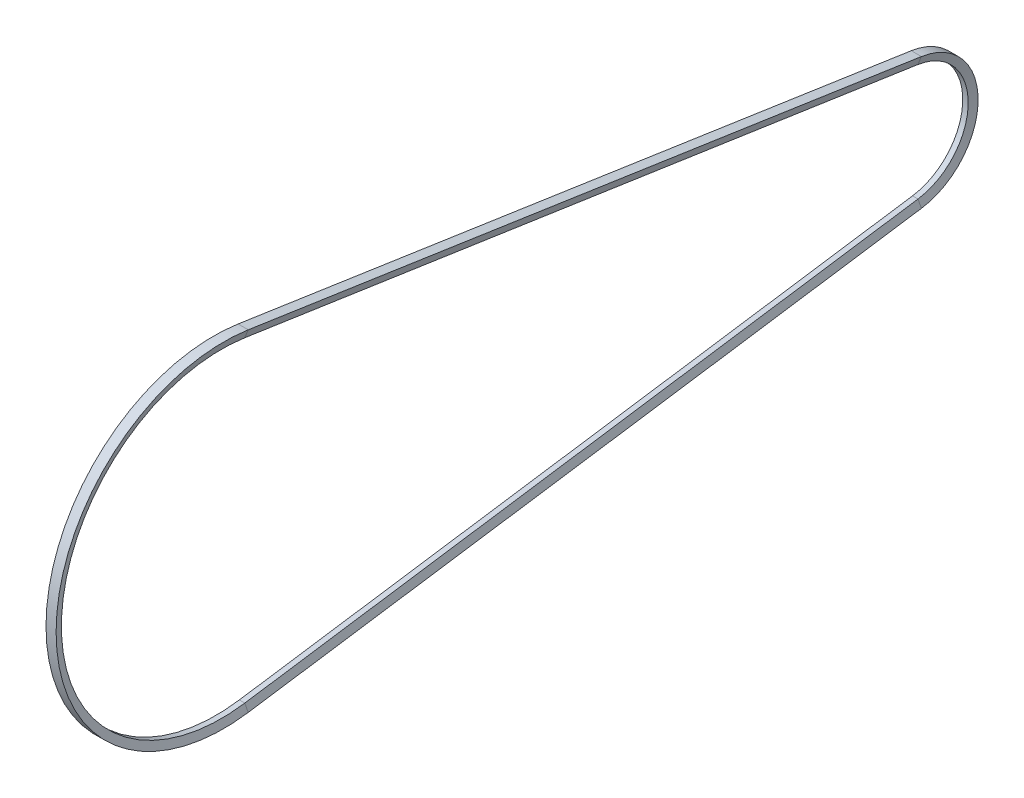
ISO-10303-21;
HEADER;
FILE_DESCRIPTION(('STEP AP214'),'2;1');
FILE_NAME('part.step','',(''),(''),'','','');
FILE_SCHEMA(('AUTOMOTIVE_DESIGN { 1 0 10303 214 1 1 1 1 }'));
ENDSEC;
DATA;
#1=APPLICATION_CONTEXT('core data for automotive mechanical design processes');
#2=APPLICATION_PROTOCOL_DEFINITION('international standard','automotive_design',2000,#1);
#3=PRODUCT_CONTEXT('',#1,'mechanical');
#4=PRODUCT('Part','Part','',(#3));
#5=PRODUCT_RELATED_PRODUCT_CATEGORY('part','',(#4));
#6=PRODUCT_DEFINITION_FORMATION('','',#4);
#7=PRODUCT_DEFINITION_CONTEXT('part definition',#1,'design');
#8=PRODUCT_DEFINITION('design','',#6,#7);
#9=PRODUCT_DEFINITION_SHAPE('','',#8);
#10=(LENGTH_UNIT() NAMED_UNIT(*) SI_UNIT(.MILLI.,.METRE.));
#11=(NAMED_UNIT(*) PLANE_ANGLE_UNIT() SI_UNIT($,.RADIAN.));
#12=(NAMED_UNIT(*) SI_UNIT($,.STERADIAN.) SOLID_ANGLE_UNIT());
#13=UNCERTAINTY_MEASURE_WITH_UNIT(LENGTH_MEASURE(1.E-05),#10,'distance_accuracy_value','');
#14=(GEOMETRIC_REPRESENTATION_CONTEXT(3) GLOBAL_UNCERTAINTY_ASSIGNED_CONTEXT((#13)) GLOBAL_UNIT_ASSIGNED_CONTEXT((#10,
#11,#12)) REPRESENTATION_CONTEXT('',''));
#15=CARTESIAN_POINT('',(0.,0.,0.));
#16=DIRECTION('',(0.,0.,1.));
#17=DIRECTION('',(1.,0.,0.));
#18=AXIS2_PLACEMENT_3D('',#15,#16,#17);
#19=CARTESIAN_POINT('',(5.12805125514121,109.499825302655,-1310.06663737334));
#20=DIRECTION('',(0.,-0.989158313483776,0.146853092803426));
#21=DIRECTION('',(0.,-0.146853092803426,-0.989158313483776));
#22=AXIS2_PLACEMENT_3D('',#19,#20,#21);
#23=PLANE('',#22);
#24=DIRECTION('',(1.,0.,0.));
#25=VECTOR('',#24,1.);
#26=CARTESIAN_POINT('',(5.12805125514121,109.499825302655,-1310.06663737334));
#27=LINE('',#26,#25);
#28=CARTESIAN_POINT('',(-5.12805125514121,109.499825302655,-1310.06663737334));
#29=VERTEX_POINT('',#28);
#30=CARTESIAN_POINT('',(5.12805125514121,109.499825302655,-1310.06663737334));
#31=VERTEX_POINT('',#30);
#32=EDGE_CURVE('E165',#29,#31,#27,.T.);
#33=ORIENTED_EDGE('',*,*,#32,.T.);
#34=DIRECTION('',(0.,0.146853092803426,0.989158313483776));
#35=VECTOR('',#34,1.);
#36=CARTESIAN_POINT('',(5.12805125514121,109.499825302655,-1310.06663737334));
#37=LINE('',#36,#35);
#38=CARTESIAN_POINT('',(5.12805125514121,297.439904864572,-44.1587250059865));
#39=VERTEX_POINT('',#38);
#40=EDGE_CURVE('E46',#31,#39,#37,.T.);
#41=ORIENTED_EDGE('',*,*,#40,.T.);
#42=DIRECTION('',(1.,0.,0.));
#43=VECTOR('',#42,1.);
#44=CARTESIAN_POINT('',(5.12805125514121,297.439904864572,-44.1587250059865));
#45=LINE('',#44,#43);
#46=CARTESIAN_POINT('',(-5.12805125514121,297.439904864572,-44.1587250059865));
#47=VERTEX_POINT('',#46);
#48=EDGE_CURVE('E186',#47,#39,#45,.T.);
#49=ORIENTED_EDGE('',*,*,#48,.F.);
#50=DIRECTION('',(0.,0.146853092803426,0.989158313483776));
#51=VECTOR('',#50,1.);
#52=CARTESIAN_POINT('',(-5.12805125514121,109.499825302655,-1310.06663737334));
#53=LINE('',#52,#51);
#54=EDGE_CURVE('E11',#29,#47,#53,.T.);
#55=ORIENTED_EDGE('',*,*,#54,.F.);
#56=EDGE_LOOP('',(#33,#41,#49,#55));
#57=FACE_BOUND('',#56,.T.);
#58=ADVANCED_FACE('F38',(#57),#23,.T.);
#59=CARTESIAN_POINT('',(9.5,123.644789185473,-1312.16663660042));
#60=DIRECTION('',(0.956304755963036,-0.289201902353916,0.0429356890867433));
#61=DIRECTION('',(0.289468839486019,0.957187437739661,0.));
#62=AXIS2_PLACEMENT_3D('',#59,#60,#61);
#63=PLANE('',#62);
#64=DIRECTION('',(0.292371704722734,0.945936799584913,-0.140436311075785));
#65=VECTOR('',#64,1.);
#66=CARTESIAN_POINT('',(9.5,123.644789185473,-1312.16663660042));
#67=LINE('',#66,#65);
#68=CARTESIAN_POINT('',(9.5,123.644789185473,-1312.16663660042));
#69=VERTEX_POINT('',#68);
#70=EDGE_CURVE('E162',#31,#69,#67,.T.);
#71=ORIENTED_EDGE('',*,*,#70,.T.);
#72=DIRECTION('',(0.,0.146853092803426,0.989158313483776));
#73=VECTOR('',#72,1.);
#74=CARTESIAN_POINT('',(9.5,123.644789185473,-1312.16663660042));
#75=LINE('',#74,#73);
#76=CARTESIAN_POINT('',(9.5,311.58486874739,-46.2587242330752));
#77=VERTEX_POINT('',#76);
#78=EDGE_CURVE('E191',#69,#77,#75,.T.);
#79=ORIENTED_EDGE('',*,*,#78,.T.);
#80=DIRECTION('',(0.292371704722734,0.945936799584913,-0.140436311075785));
#81=VECTOR('',#80,1.);
#82=CARTESIAN_POINT('',(9.5,311.58486874739,-46.2587242330752));
#83=LINE('',#82,#81);
#84=EDGE_CURVE('E184',#39,#77,#83,.T.);
#85=ORIENTED_EDGE('',*,*,#84,.F.);
#86=ORIENTED_EDGE('',*,*,#40,.F.);
#87=EDGE_LOOP('',(#71,#79,#85,#86));
#88=FACE_BOUND('',#87,.T.);
#89=ADVANCED_FACE('F215',(#88),#63,.T.);
#90=CARTESIAN_POINT('',(-9.5,123.644789185473,-1312.16663660042));
#91=DIRECTION('',(0.,0.989158313483776,-0.146853092803426));
#92=DIRECTION('',(0.,0.146853092803426,0.989158313483776));
#93=AXIS2_PLACEMENT_3D('',#90,#91,#92);
#94=PLANE('',#93);
#95=DIRECTION('',(-1.,0.,0.));
#96=VECTOR('',#95,1.);
#97=CARTESIAN_POINT('',(-9.5,123.644789185473,-1312.16663660042));
#98=LINE('',#97,#96);
#99=CARTESIAN_POINT('',(-9.5,123.644789185473,-1312.16663660042));
#100=VERTEX_POINT('',#99);
#101=EDGE_CURVE('E159',#69,#100,#98,.T.);
#102=ORIENTED_EDGE('',*,*,#101,.T.);
#103=DIRECTION('',(0.,0.146853092803426,0.989158313483776));
#104=VECTOR('',#103,1.);
#105=CARTESIAN_POINT('',(-9.5,123.644789185473,-1312.16663660042));
#106=LINE('',#105,#104);
#107=CARTESIAN_POINT('',(-9.5,311.58486874739,-46.2587242330752));
#108=VERTEX_POINT('',#107);
#109=EDGE_CURVE('E188',#100,#108,#106,.T.);
#110=ORIENTED_EDGE('',*,*,#109,.T.);
#111=DIRECTION('',(-1.,0.,0.));
#112=VECTOR('',#111,1.);
#113=CARTESIAN_POINT('',(-9.5,311.58486874739,-46.2587242330752));
#114=LINE('',#113,#112);
#115=EDGE_CURVE('E181',#77,#108,#114,.T.);
#116=ORIENTED_EDGE('',*,*,#115,.F.);
#117=ORIENTED_EDGE('',*,*,#78,.F.);
#118=EDGE_LOOP('',(#102,#110,#116,#117));
#119=FACE_BOUND('',#118,.T.);
#120=ADVANCED_FACE('F214',(#119),#94,.T.);
#121=CARTESIAN_POINT('',(-5.12805125514121,109.499825302655,-1310.06663737334));
#122=DIRECTION('',(-0.956304755963036,-0.289201902353916,0.0429356890867433));
#123=DIRECTION('',(0.289468839486019,-0.957187437739661,0.));
#124=AXIS2_PLACEMENT_3D('',#121,#122,#123);
#125=PLANE('',#124);
#126=DIRECTION('',(0.292371704722734,-0.945936799584913,0.140436311075785));
#127=VECTOR('',#126,1.);
#128=CARTESIAN_POINT('',(-5.12805125514121,109.499825302655,-1310.06663737334));
#129=LINE('',#128,#127);
#130=EDGE_CURVE('E117',#100,#29,#129,.T.);
#131=ORIENTED_EDGE('',*,*,#130,.T.);
#132=ORIENTED_EDGE('',*,*,#54,.T.);
#133=DIRECTION('',(0.292371704722734,-0.945936799584913,0.140436311075785));
#134=VECTOR('',#133,1.);
#135=CARTESIAN_POINT('',(-5.12805125514121,297.439904864572,-44.1587250059865));
#136=LINE('',#135,#134);
#137=EDGE_CURVE('E130',#108,#47,#136,.T.);
#138=ORIENTED_EDGE('',*,*,#137,.F.);
#139=ORIENTED_EDGE('',*,*,#109,.F.);
#140=EDGE_LOOP('',(#131,#132,#138,#139));
#141=FACE_BOUND('',#140,.T.);
#142=ADVANCED_FACE('F248',(#141),#125,.T.);
#143=CARTESIAN_POINT('',(0.,0.,-1293.81));
#144=DIRECTION('',(1.,0.,0.));
#145=DIRECTION('',(0.,0.,-1.));
#146=AXIS2_PLACEMENT_3D('',#143,#144,#145);
#147=CYLINDRICAL_SURFACE('',#146,110.7);
#148=DIRECTION('',(1.,0.,0.));
#149=VECTOR('',#148,1.);
#150=CARTESIAN_POINT('',(5.12805125514121,-109.499825302653,-1310.06663737334));
#151=LINE('',#150,#149);
#152=CARTESIAN_POINT('',(-5.12805125514121,-109.499825302653,-1310.06663737334));
#153=VERTEX_POINT('',#152);
#154=CARTESIAN_POINT('',(5.12805125514121,-109.499825302653,-1310.06663737334));
#155=VERTEX_POINT('',#154);
#156=EDGE_CURVE('E114',#153,#155,#151,.T.);
#157=ORIENTED_EDGE('',*,*,#156,.T.);
#158=CARTESIAN_POINT('',(5.12805125514121,0.,-1293.81));
#159=DIRECTION('',(1.,0.,0.));
#160=DIRECTION('',(0.,0.,-1.));
#161=AXIS2_PLACEMENT_3D('',#158,#159,#160);
#162=CIRCLE('',#161,110.7);
#163=EDGE_CURVE('E174',#155,#31,#162,.T.);
#164=ORIENTED_EDGE('',*,*,#163,.T.);
#165=ORIENTED_EDGE('',*,*,#32,.F.);
#166=CARTESIAN_POINT('',(-5.12805125514121,0.,-1293.81));
#167=DIRECTION('',(1.,0.,0.));
#168=DIRECTION('',(0.,0.,-1.));
#169=AXIS2_PLACEMENT_3D('',#166,#167,#168);
#170=CIRCLE('',#169,110.7);
#171=EDGE_CURVE('E177',#153,#29,#170,.T.);
#172=ORIENTED_EDGE('',*,*,#171,.F.);
#173=EDGE_LOOP('',(#157,#164,#165,#172));
#174=FACE_BOUND('',#173,.T.);
#175=ADVANCED_FACE('F245',(#174),#147,.F.);
#176=CARTESIAN_POINT('',(5.12805125514121,0.,-1293.81));
#177=DIRECTION('',(1.,0.,0.));
#178=DIRECTION('',(0.,0.,-1.));
#179=AXIS2_PLACEMENT_3D('',#176,#177,#178);
#180=CONICAL_SURFACE('',#179,110.7,1.27409035395586);
#181=DIRECTION('',(0.292371704722734,-0.945936799584909,-0.14043631107581));
#182=VECTOR('',#181,1.);
#183=CARTESIAN_POINT('',(9.5,-123.644789185471,-1312.16663660043));
#184=LINE('',#183,#182);
#185=CARTESIAN_POINT('',(9.5,-123.644789185471,-1312.16663660043));
#186=VERTEX_POINT('',#185);
#187=EDGE_CURVE('E148',#155,#186,#184,.T.);
#188=ORIENTED_EDGE('',*,*,#187,.T.);
#189=CARTESIAN_POINT('',(9.5,0.,-1293.81));
#190=DIRECTION('',(1.,0.,0.));
#191=DIRECTION('',(0.,0.,-1.));
#192=AXIS2_PLACEMENT_3D('',#189,#190,#191);
#193=CIRCLE('',#192,125.);
#194=EDGE_CURVE('E171',#186,#69,#193,.T.);
#195=ORIENTED_EDGE('',*,*,#194,.T.);
#196=ORIENTED_EDGE('',*,*,#70,.F.);
#197=ORIENTED_EDGE('',*,*,#163,.F.);
#198=EDGE_LOOP('',(#188,#195,#196,#197));
#199=FACE_BOUND('',#198,.T.);
#200=ADVANCED_FACE('F222',(#199),#180,.F.);
#201=CARTESIAN_POINT('',(0.,0.,-1293.81));
#202=DIRECTION('',(1.,0.,0.));
#203=DIRECTION('',(0.,0.,-1.));
#204=AXIS2_PLACEMENT_3D('',#201,#202,#203);
#205=CYLINDRICAL_SURFACE('',#204,125.);
#206=DIRECTION('',(-1.,0.,0.));
#207=VECTOR('',#206,1.);
#208=CARTESIAN_POINT('',(-9.5,-123.644789185471,-1312.16663660043));
#209=LINE('',#208,#207);
#210=CARTESIAN_POINT('',(-9.5,-123.644789185471,-1312.16663660043));
#211=VERTEX_POINT('',#210);
#212=EDGE_CURVE('E144',#186,#211,#209,.T.);
#213=ORIENTED_EDGE('',*,*,#212,.T.);
#214=CARTESIAN_POINT('',(-9.5,0.,-1293.81));
#215=DIRECTION('',(1.,0.,0.));
#216=DIRECTION('',(0.,0.,-1.));
#217=AXIS2_PLACEMENT_3D('',#214,#215,#216);
#218=CIRCLE('',#217,125.);
#219=EDGE_CURVE('E168',#211,#100,#218,.T.);
#220=ORIENTED_EDGE('',*,*,#219,.T.);
#221=ORIENTED_EDGE('',*,*,#101,.F.);
#222=ORIENTED_EDGE('',*,*,#194,.F.);
#223=EDGE_LOOP('',(#213,#220,#221,#222));
#224=FACE_BOUND('',#223,.T.);
#225=ADVANCED_FACE('F220',(#224),#205,.T.);
#226=CARTESIAN_POINT('',(-9.5,0.,-1293.81));
#227=DIRECTION('',(-1.,0.,0.));
#228=DIRECTION('',(0.,0.,1.));
#229=AXIS2_PLACEMENT_3D('',#226,#227,#228);
#230=CONICAL_SURFACE('',#229,125.,1.27409035395586);
#231=DIRECTION('',(0.292371704722734,0.945936799584909,0.14043631107581));
#232=VECTOR('',#231,1.);
#233=CARTESIAN_POINT('',(-5.12805125514121,-109.499825302653,-1310.06663737334));
#234=LINE('',#233,#232);
#235=EDGE_CURVE('E141',#211,#153,#234,.T.);
#236=ORIENTED_EDGE('',*,*,#235,.T.);
#237=ORIENTED_EDGE('',*,*,#171,.T.);
#238=ORIENTED_EDGE('',*,*,#130,.F.);
#239=ORIENTED_EDGE('',*,*,#219,.F.);
#240=EDGE_LOOP('',(#236,#237,#238,#239));
#241=FACE_BOUND('',#240,.T.);
#242=ADVANCED_FACE('F236',(#241),#230,.F.);
#243=CARTESIAN_POINT('',(5.12805125514121,-297.439904864571,-44.1587250059943));
#244=DIRECTION('',(0.,0.989158313483776,0.146853092803426));
#245=DIRECTION('',(0.,-0.146853092803426,0.989158313483776));
#246=AXIS2_PLACEMENT_3D('',#243,#244,#245);
#247=PLANE('',#246);
#248=DIRECTION('',(1.,0.,0.));
#249=VECTOR('',#248,1.);
#250=CARTESIAN_POINT('',(5.12805125514121,-297.439904864571,-44.1587250059943));
#251=LINE('',#250,#249);
#252=CARTESIAN_POINT('',(-5.12805125514121,-297.439904864571,-44.1587250059943));
#253=VERTEX_POINT('',#252);
#254=CARTESIAN_POINT('',(5.12805125514121,-297.439904864571,-44.1587250059943));
#255=VERTEX_POINT('',#254);
#256=EDGE_CURVE('E112',#253,#255,#251,.T.);
#257=ORIENTED_EDGE('',*,*,#256,.T.);
#258=DIRECTION('',(0.,0.146853092803426,-0.989158313483776));
#259=VECTOR('',#258,1.);
#260=CARTESIAN_POINT('',(5.12805125514121,-297.439904864571,-44.1587250059943));
#261=LINE('',#260,#259);
#262=EDGE_CURVE('E118',#255,#155,#261,.T.);
#263=ORIENTED_EDGE('',*,*,#262,.T.);
#264=ORIENTED_EDGE('',*,*,#156,.F.);
#265=DIRECTION('',(0.,0.146853092803426,-0.989158313483776));
#266=VECTOR('',#265,1.);
#267=CARTESIAN_POINT('',(-5.12805125514121,-297.439904864571,-44.1587250059943));
#268=LINE('',#267,#266);
#269=EDGE_CURVE('E108',#253,#153,#268,.T.);
#270=ORIENTED_EDGE('',*,*,#269,.F.);
#271=EDGE_LOOP('',(#257,#263,#264,#270));
#272=FACE_BOUND('',#271,.T.);
#273=ADVANCED_FACE('F110',(#272),#247,.T.);
#274=CARTESIAN_POINT('',(9.5,-311.584868747389,-46.2587242330835));
#275=DIRECTION('',(0.956304755963036,0.289201902353916,0.0429356890867434));
#276=DIRECTION('',(-0.289468839486019,0.957187437739661,0.));
#277=AXIS2_PLACEMENT_3D('',#274,#275,#276);
#278=PLANE('',#277);
#279=DIRECTION('',(0.292371704722734,-0.945936799584909,-0.14043631107581));
#280=VECTOR('',#279,1.);
#281=CARTESIAN_POINT('',(9.5,-311.584868747389,-46.2587242330835));
#282=LINE('',#281,#280);
#283=CARTESIAN_POINT('',(9.5,-311.584868747389,-46.2587242330835));
#284=VERTEX_POINT('',#283);
#285=EDGE_CURVE('E135',#255,#284,#282,.T.);
#286=ORIENTED_EDGE('',*,*,#285,.T.);
#287=DIRECTION('',(0.,0.146853092803426,-0.989158313483776));
#288=VECTOR('',#287,1.);
#289=CARTESIAN_POINT('',(9.5,-311.584868747389,-46.2587242330835));
#290=LINE('',#289,#288);
#291=EDGE_CURVE('E153',#284,#186,#290,.T.);
#292=ORIENTED_EDGE('',*,*,#291,.T.);
#293=ORIENTED_EDGE('',*,*,#187,.F.);
#294=ORIENTED_EDGE('',*,*,#262,.F.);
#295=EDGE_LOOP('',(#286,#292,#293,#294));
#296=FACE_BOUND('',#295,.T.);
#297=ADVANCED_FACE('F228',(#296),#278,.T.);
#298=CARTESIAN_POINT('',(-9.5,-311.584868747389,-46.2587242330835));
#299=DIRECTION('',(0.,-0.989158313483776,-0.146853092803426));
#300=DIRECTION('',(0.,0.146853092803426,-0.989158313483776));
#301=AXIS2_PLACEMENT_3D('',#298,#299,#300);
#302=PLANE('',#301);
#303=DIRECTION('',(-1.,0.,0.));
#304=VECTOR('',#303,1.);
#305=CARTESIAN_POINT('',(-9.5,-311.584868747389,-46.2587242330835));
#306=LINE('',#305,#304);
#307=CARTESIAN_POINT('',(-9.5,-311.584868747389,-46.2587242330835));
#308=VERTEX_POINT('',#307);
#309=EDGE_CURVE('E132',#284,#308,#306,.T.);
#310=ORIENTED_EDGE('',*,*,#309,.T.);
#311=DIRECTION('',(0.,0.146853092803426,-0.989158313483776));
#312=VECTOR('',#311,1.);
#313=CARTESIAN_POINT('',(-9.5,-311.584868747389,-46.2587242330835));
#314=LINE('',#313,#312);
#315=EDGE_CURVE('E124',#308,#211,#314,.T.);
#316=ORIENTED_EDGE('',*,*,#315,.T.);
#317=ORIENTED_EDGE('',*,*,#212,.F.);
#318=ORIENTED_EDGE('',*,*,#291,.F.);
#319=EDGE_LOOP('',(#310,#316,#317,#318));
#320=FACE_BOUND('',#319,.T.);
#321=ADVANCED_FACE('F227',(#320),#302,.T.);
#322=CARTESIAN_POINT('',(-5.12805125514121,-297.439904864571,-44.1587250059943));
#323=DIRECTION('',(-0.956304755963036,0.289201902353916,0.0429356890867434));
#324=DIRECTION('',(-0.289468839486019,-0.957187437739661,0.));
#325=AXIS2_PLACEMENT_3D('',#322,#323,#324);
#326=PLANE('',#325);
#327=DIRECTION('',(0.292371704722734,0.945936799584909,0.14043631107581));
#328=VECTOR('',#327,1.);
#329=CARTESIAN_POINT('',(-5.12805125514121,-297.439904864571,-44.1587250059943));
#330=LINE('',#329,#328);
#331=EDGE_CURVE('E121',#308,#253,#330,.T.);
#332=ORIENTED_EDGE('',*,*,#331,.T.);
#333=ORIENTED_EDGE('',*,*,#269,.T.);
#334=ORIENTED_EDGE('',*,*,#235,.F.);
#335=ORIENTED_EDGE('',*,*,#315,.F.);
#336=EDGE_LOOP('',(#332,#333,#334,#335));
#337=FACE_BOUND('',#336,.T.);
#338=ADVANCED_FACE('F122',(#337),#326,.T.);
#339=CARTESIAN_POINT('',(-9.5,0.,0.));
#340=DIRECTION('',(-1.,0.,0.));
#341=DIRECTION('',(0.,0.,1.));
#342=AXIS2_PLACEMENT_3D('',#339,#340,#341);
#343=CONICAL_SURFACE('',#342,315.,1.27409035395586);
#344=CARTESIAN_POINT('',(-9.5,0.,0.));
#345=DIRECTION('',(-1.,0.,0.));
#346=DIRECTION('',(0.,0.,1.));
#347=AXIS2_PLACEMENT_3D('',#344,#345,#346);
#348=CIRCLE('',#347,315.);
#349=EDGE_CURVE('E145',#308,#108,#348,.T.);
#350=ORIENTED_EDGE('',*,*,#349,.T.);
#351=ORIENTED_EDGE('',*,*,#137,.T.);
#352=CARTESIAN_POINT('',(-5.12805125514121,0.,0.));
#353=DIRECTION('',(-1.,0.,0.));
#354=DIRECTION('',(0.,0.,1.));
#355=AXIS2_PLACEMENT_3D('',#352,#353,#354);
#356=CIRCLE('',#355,300.7);
#357=EDGE_CURVE('E54',#253,#47,#356,.T.);
#358=ORIENTED_EDGE('',*,*,#357,.F.);
#359=ORIENTED_EDGE('',*,*,#331,.F.);
#360=EDGE_LOOP('',(#350,#351,#358,#359));
#361=FACE_BOUND('',#360,.T.);
#362=ADVANCED_FACE('F128',(#361),#343,.F.);
#363=CARTESIAN_POINT('',(0.,0.,0.));
#364=DIRECTION('',(-1.,0.,0.));
#365=DIRECTION('',(0.,0.,1.));
#366=AXIS2_PLACEMENT_3D('',#363,#364,#365);
#367=CYLINDRICAL_SURFACE('',#366,315.);
#368=CARTESIAN_POINT('',(9.5,0.,0.));
#369=DIRECTION('',(-1.,0.,0.));
#370=DIRECTION('',(0.,0.,1.));
#371=AXIS2_PLACEMENT_3D('',#368,#369,#370);
#372=CIRCLE('',#371,315.);
#373=EDGE_CURVE('E199',#284,#77,#372,.T.);
#374=ORIENTED_EDGE('',*,*,#373,.T.);
#375=ORIENTED_EDGE('',*,*,#115,.T.);
#376=ORIENTED_EDGE('',*,*,#349,.F.);
#377=ORIENTED_EDGE('',*,*,#309,.F.);
#378=EDGE_LOOP('',(#374,#375,#376,#377));
#379=FACE_BOUND('',#378,.T.);
#380=ADVANCED_FACE('F207',(#379),#367,.T.);
#381=CARTESIAN_POINT('',(5.12805125514121,0.,0.));
#382=DIRECTION('',(1.,0.,0.));
#383=DIRECTION('',(0.,0.,-1.));
#384=AXIS2_PLACEMENT_3D('',#381,#382,#383);
#385=CONICAL_SURFACE('',#384,300.7,1.27409035395586);
#386=CARTESIAN_POINT('',(5.12805125514121,0.,0.));
#387=DIRECTION('',(-1.,0.,0.));
#388=DIRECTION('',(0.,0.,1.));
#389=AXIS2_PLACEMENT_3D('',#386,#387,#388);
#390=CIRCLE('',#389,300.7);
#391=EDGE_CURVE('E62',#255,#39,#390,.T.);
#392=ORIENTED_EDGE('',*,*,#391,.T.);
#393=ORIENTED_EDGE('',*,*,#84,.T.);
#394=ORIENTED_EDGE('',*,*,#373,.F.);
#395=ORIENTED_EDGE('',*,*,#285,.F.);
#396=EDGE_LOOP('',(#392,#393,#394,#395));
#397=FACE_BOUND('',#396,.T.);
#398=ADVANCED_FACE('F211',(#397),#385,.F.);
#399=CARTESIAN_POINT('',(0.,0.,0.));
#400=DIRECTION('',(-1.,0.,0.));
#401=DIRECTION('',(0.,0.,1.));
#402=AXIS2_PLACEMENT_3D('',#399,#400,#401);
#403=CYLINDRICAL_SURFACE('',#402,300.7);
#404=ORIENTED_EDGE('',*,*,#256,.F.);
#405=ORIENTED_EDGE('',*,*,#357,.T.);
#406=ORIENTED_EDGE('',*,*,#48,.T.);
#407=ORIENTED_EDGE('',*,*,#391,.F.);
#408=EDGE_LOOP('',(#404,#405,#406,#407));
#409=FACE_BOUND('',#408,.T.);
#410=ADVANCED_FACE('F134',(#409),#403,.F.);
#411=CLOSED_SHELL('',(#58,#89,#120,#142,#175,#200,#225,#242,#273,#297,#321,#338,#362,#380,#398,#410));
#412=MANIFOLD_SOLID_BREP('B2',#411);
#413=ADVANCED_BREP_SHAPE_REPRESENTATION('',(#18,#412),#14);
#414=SHAPE_DEFINITION_REPRESENTATION(#9,#413);
ENDSEC;
END-ISO-10303-21;
